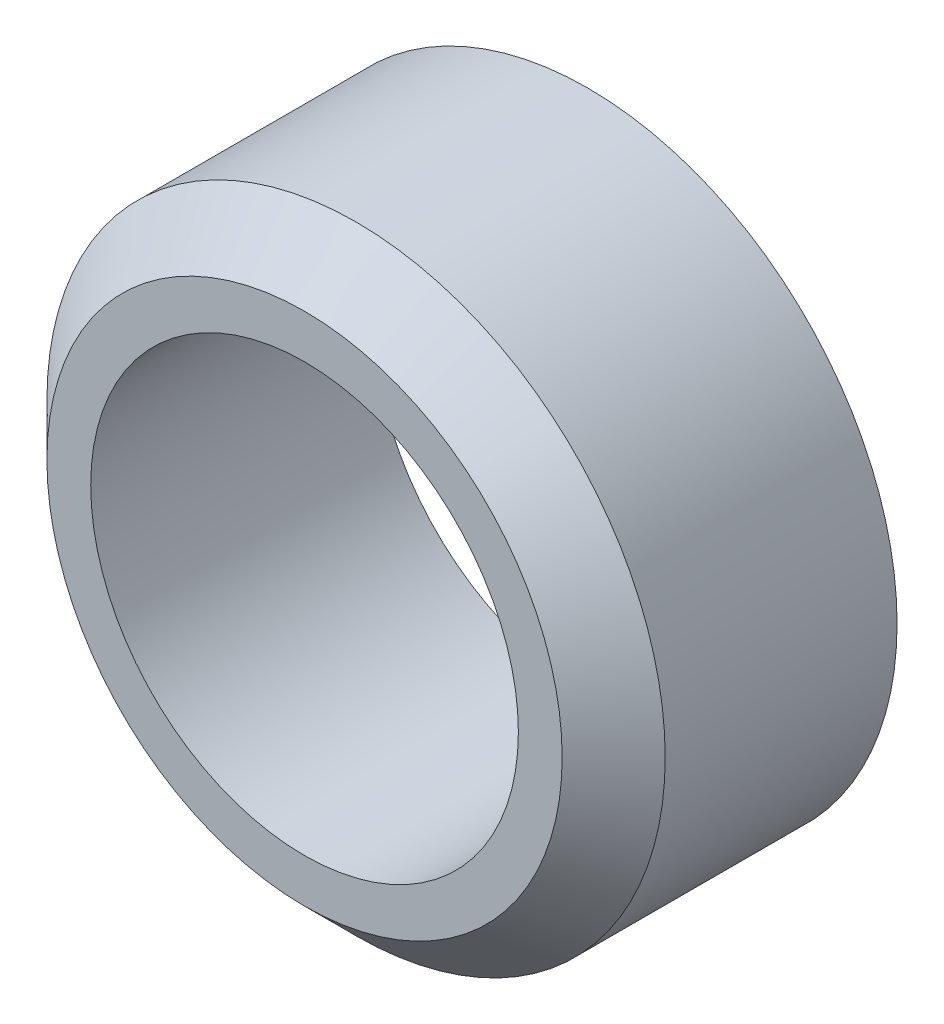
ISO-10303-21;
HEADER;
FILE_DESCRIPTION(('STEP AP214'),'2;1');
FILE_NAME('part.step','',(''),(''),'','','');
FILE_SCHEMA(('AUTOMOTIVE_DESIGN { 1 0 10303 214 1 1 1 1 }'));
ENDSEC;
DATA;
#1=APPLICATION_CONTEXT('core data for automotive mechanical design processes');
#2=APPLICATION_PROTOCOL_DEFINITION('international standard','automotive_design',2000,#1);
#3=PRODUCT_CONTEXT('',#1,'mechanical');
#4=PRODUCT('Part','Part','',(#3));
#5=PRODUCT_RELATED_PRODUCT_CATEGORY('part','',(#4));
#6=PRODUCT_DEFINITION_FORMATION('','',#4);
#7=PRODUCT_DEFINITION_CONTEXT('part definition',#1,'design');
#8=PRODUCT_DEFINITION('design','',#6,#7);
#9=PRODUCT_DEFINITION_SHAPE('','',#8);
#10=(LENGTH_UNIT() NAMED_UNIT(*) SI_UNIT(.MILLI.,.METRE.));
#11=(NAMED_UNIT(*) PLANE_ANGLE_UNIT() SI_UNIT($,.RADIAN.));
#12=(NAMED_UNIT(*) SI_UNIT($,.STERADIAN.) SOLID_ANGLE_UNIT());
#13=UNCERTAINTY_MEASURE_WITH_UNIT(LENGTH_MEASURE(1.E-05),#10,'distance_accuracy_value','');
#14=(GEOMETRIC_REPRESENTATION_CONTEXT(3) GLOBAL_UNCERTAINTY_ASSIGNED_CONTEXT((#13)) GLOBAL_UNIT_ASSIGNED_CONTEXT((#10,
#11,#12)) REPRESENTATION_CONTEXT('',''));
#15=CARTESIAN_POINT('',(0.,0.,0.));
#16=DIRECTION('',(0.,0.,1.));
#17=DIRECTION('',(1.,0.,0.));
#18=AXIS2_PLACEMENT_3D('',#15,#16,#17);
#19=CARTESIAN_POINT('',(0.,0.,5.5));
#20=DIRECTION('',(0.,0.,1.));
#21=DIRECTION('',(1.,0.,0.));
#22=AXIS2_PLACEMENT_3D('',#19,#20,#21);
#23=PLANE('',#22);
#24=CARTESIAN_POINT('',(0.,0.,5.5));
#25=DIRECTION('',(0.,0.,1.));
#26=DIRECTION('',(1.,0.,0.));
#27=AXIS2_PLACEMENT_3D('',#24,#25,#26);
#28=CIRCLE('',#27,5.);
#29=CARTESIAN_POINT('',(5.,0.,5.5));
#30=VERTEX_POINT('',#29);
#31=EDGE_CURVE('E43',#30,#30,#28,.T.);
#32=ORIENTED_EDGE('',*,*,#31,.T.);
#33=EDGE_LOOP('',(#32));
#34=FACE_BOUND('',#33,.T.);
#35=CARTESIAN_POINT('',(0.,0.,5.5));
#36=DIRECTION('',(0.,0.,1.));
#37=DIRECTION('',(1.,0.,0.));
#38=AXIS2_PLACEMENT_3D('',#35,#36,#37);
#39=CIRCLE('',#38,4.15);
#40=CARTESIAN_POINT('',(4.15,0.,5.5));
#41=VERTEX_POINT('',#40);
#42=EDGE_CURVE('E51',#41,#41,#39,.T.);
#43=ORIENTED_EDGE('',*,*,#42,.F.);
#44=EDGE_LOOP('',(#43));
#45=FACE_BOUND('',#44,.T.);
#46=ADVANCED_FACE('F35',(#34,#45),#23,.T.);
#47=CARTESIAN_POINT('',(0.,0.,0.));
#48=DIRECTION('',(0.,0.,1.));
#49=DIRECTION('',(1.,0.,0.));
#50=AXIS2_PLACEMENT_3D('',#47,#48,#49);
#51=PLANE('',#50);
#52=CARTESIAN_POINT('',(0.,0.,0.));
#53=DIRECTION('',(0.,0.,1.));
#54=DIRECTION('',(1.,0.,0.));
#55=AXIS2_PLACEMENT_3D('',#52,#53,#54);
#56=CIRCLE('',#55,6.);
#57=CARTESIAN_POINT('',(6.,0.,0.));
#58=VERTEX_POINT('',#57);
#59=EDGE_CURVE('E47',#58,#58,#56,.T.);
#60=ORIENTED_EDGE('',*,*,#59,.F.);
#61=EDGE_LOOP('',(#60));
#62=FACE_BOUND('',#61,.T.);
#63=CARTESIAN_POINT('',(0.,0.,0.));
#64=DIRECTION('',(0.,0.,1.));
#65=DIRECTION('',(1.,0.,0.));
#66=AXIS2_PLACEMENT_3D('',#63,#64,#65);
#67=CIRCLE('',#66,4.15);
#68=CARTESIAN_POINT('',(4.15,0.,0.));
#69=VERTEX_POINT('',#68);
#70=EDGE_CURVE('E54',#69,#69,#67,.T.);
#71=ORIENTED_EDGE('',*,*,#70,.T.);
#72=EDGE_LOOP('',(#71));
#73=FACE_BOUND('',#72,.T.);
#74=ADVANCED_FACE('F64',(#62,#73),#51,.F.);
#75=CARTESIAN_POINT('',(0.,0.,5.5));
#76=DIRECTION('',(0.,0.,-1.));
#77=DIRECTION('',(-1.,0.,0.));
#78=AXIS2_PLACEMENT_3D('',#75,#76,#77);
#79=CYLINDRICAL_SURFACE('',#78,6.);
#80=CARTESIAN_POINT('',(0.,0.,4.5));
#81=DIRECTION('',(0.,0.,1.));
#82=DIRECTION('',(1.,0.,0.));
#83=AXIS2_PLACEMENT_3D('',#80,#81,#82);
#84=CIRCLE('',#83,6.);
#85=CARTESIAN_POINT('',(6.,0.,4.5));
#86=VERTEX_POINT('',#85);
#87=EDGE_CURVE('E10',#86,#86,#84,.F.);
#88=ORIENTED_EDGE('',*,*,#87,.T.);
#89=EDGE_LOOP('',(#88));
#90=FACE_BOUND('',#89,.T.);
#91=ORIENTED_EDGE('',*,*,#59,.T.);
#92=EDGE_LOOP('',(#91));
#93=FACE_BOUND('',#92,.T.);
#94=ADVANCED_FACE('F69',(#90,#93),#79,.T.);
#95=CARTESIAN_POINT('',(0.,0.,5.5));
#96=DIRECTION('',(0.,0.,-1.));
#97=DIRECTION('',(-1.,0.,0.));
#98=AXIS2_PLACEMENT_3D('',#95,#96,#97);
#99=CYLINDRICAL_SURFACE('',#98,4.15);
#100=ORIENTED_EDGE('',*,*,#42,.T.);
#101=EDGE_LOOP('',(#100));
#102=FACE_BOUND('',#101,.T.);
#103=ORIENTED_EDGE('',*,*,#70,.F.);
#104=EDGE_LOOP('',(#103));
#105=FACE_BOUND('',#104,.T.);
#106=ADVANCED_FACE('F60',(#102,#105),#99,.F.);
#107=CARTESIAN_POINT('',(0.,0.,5.5));
#108=DIRECTION('',(0.,0.,-1.));
#109=DIRECTION('',(-1.,0.,0.));
#110=AXIS2_PLACEMENT_3D('',#107,#108,#109);
#111=CONICAL_SURFACE('',#110,5.,0.785398163397445);
#112=ORIENTED_EDGE('',*,*,#87,.F.);
#113=EDGE_LOOP('',(#112));
#114=FACE_BOUND('',#113,.T.);
#115=ORIENTED_EDGE('',*,*,#31,.F.);
#116=EDGE_LOOP('',(#115));
#117=FACE_BOUND('',#116,.T.);
#118=ADVANCED_FACE('F38',(#114,#117),#111,.T.);
#119=CLOSED_SHELL('',(#46,#74,#94,#106,#118));
#120=MANIFOLD_SOLID_BREP('B2',#119);
#121=ADVANCED_BREP_SHAPE_REPRESENTATION('',(#18,#120),#14);
#122=SHAPE_DEFINITION_REPRESENTATION(#9,#121);
ENDSEC;
END-ISO-10303-21;
